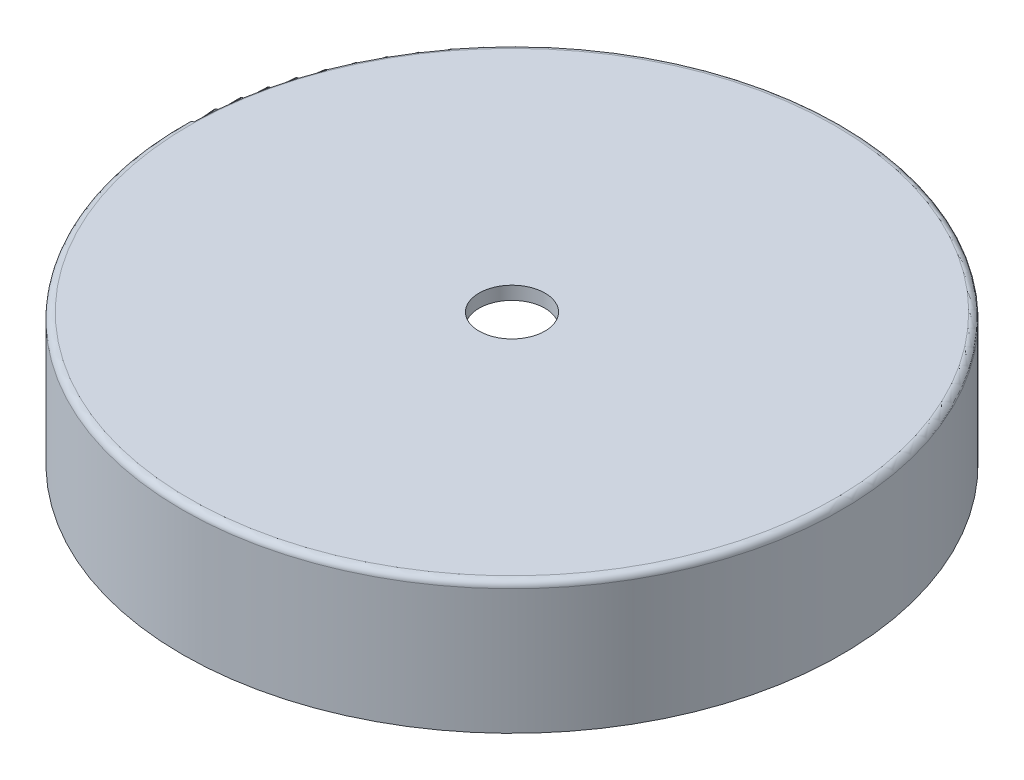
ISO-10303-21;
HEADER;
FILE_DESCRIPTION(('STEP AP214'),'2;1');
FILE_NAME('part.step','',(''),(''),'','','');
FILE_SCHEMA(('AUTOMOTIVE_DESIGN { 1 0 10303 214 1 1 1 1 }'));
ENDSEC;
DATA;
#1=APPLICATION_CONTEXT('core data for automotive mechanical design processes');
#2=APPLICATION_PROTOCOL_DEFINITION('international standard','automotive_design',2000,#1);
#3=PRODUCT_CONTEXT('',#1,'mechanical');
#4=PRODUCT('Part','Part','',(#3));
#5=PRODUCT_RELATED_PRODUCT_CATEGORY('part','',(#4));
#6=PRODUCT_DEFINITION_FORMATION('','',#4);
#7=PRODUCT_DEFINITION_CONTEXT('part definition',#1,'design');
#8=PRODUCT_DEFINITION('design','',#6,#7);
#9=PRODUCT_DEFINITION_SHAPE('','',#8);
#10=(LENGTH_UNIT() NAMED_UNIT(*) SI_UNIT(.MILLI.,.METRE.));
#11=(NAMED_UNIT(*) PLANE_ANGLE_UNIT() SI_UNIT($,.RADIAN.));
#12=(NAMED_UNIT(*) SI_UNIT($,.STERADIAN.) SOLID_ANGLE_UNIT());
#13=UNCERTAINTY_MEASURE_WITH_UNIT(LENGTH_MEASURE(1.E-05),#10,'distance_accuracy_value','');
#14=(GEOMETRIC_REPRESENTATION_CONTEXT(3) GLOBAL_UNCERTAINTY_ASSIGNED_CONTEXT((#13)) GLOBAL_UNIT_ASSIGNED_CONTEXT((#10,
#11,#12)) REPRESENTATION_CONTEXT('',''));
#15=CARTESIAN_POINT('',(0.,0.,0.));
#16=DIRECTION('',(0.,0.,1.));
#17=DIRECTION('',(1.,0.,0.));
#18=AXIS2_PLACEMENT_3D('',#15,#16,#17);
#19=CARTESIAN_POINT('',(0.,10.,0.));
#20=DIRECTION('',(0.,-1.,0.));
#21=DIRECTION('',(0.,0.,-1.));
#22=AXIS2_PLACEMENT_3D('',#19,#20,#21);
#23=PLANE('',#22);
#24=CARTESIAN_POINT('',(0.,10.,0.));
#25=DIRECTION('',(0.,1.,0.));
#26=DIRECTION('',(0.,0.,1.));
#27=AXIS2_PLACEMENT_3D('',#24,#25,#26);
#28=CIRCLE('',#27,2.5);
#29=CARTESIAN_POINT('',(0.,10.,2.5));
#30=VERTEX_POINT('',#29);
#31=EDGE_CURVE('E56',#30,#30,#28,.T.);
#32=ORIENTED_EDGE('',*,*,#31,.F.);
#33=EDGE_LOOP('',(#32));
#34=FACE_BOUND('',#33,.T.);
#35=CARTESIAN_POINT('',(0.,10.,0.));
#36=DIRECTION('',(0.,-1.,0.));
#37=DIRECTION('',(0.,0.,-1.));
#38=AXIS2_PLACEMENT_3D('',#35,#36,#37);
#39=CIRCLE('',#38,24.5);
#40=CARTESIAN_POINT('',(0.,10.,-24.5));
#41=VERTEX_POINT('',#40);
#42=EDGE_CURVE('E10',#41,#41,#39,.F.);
#43=ORIENTED_EDGE('',*,*,#42,.T.);
#44=EDGE_LOOP('',(#43));
#45=FACE_BOUND('',#44,.T.);
#46=ADVANCED_FACE('F30',(#34,#45),#23,.F.);
#47=CARTESIAN_POINT('',(0.,0.,0.));
#48=DIRECTION('',(0.,-1.,0.));
#49=DIRECTION('',(0.,0.,-1.));
#50=AXIS2_PLACEMENT_3D('',#47,#48,#49);
#51=CYLINDRICAL_SURFACE('',#50,25.);
#52=CARTESIAN_POINT('',(0.,9.5,0.));
#53=DIRECTION('',(0.,-1.,0.));
#54=DIRECTION('',(0.,0.,-1.));
#55=AXIS2_PLACEMENT_3D('',#52,#53,#54);
#56=CIRCLE('',#55,25.);
#57=CARTESIAN_POINT('',(0.,9.5,-25.));
#58=VERTEX_POINT('',#57);
#59=EDGE_CURVE('E38',#58,#58,#56,.T.);
#60=ORIENTED_EDGE('',*,*,#59,.T.);
#61=EDGE_LOOP('',(#60));
#62=FACE_BOUND('',#61,.T.);
#63=CARTESIAN_POINT('',(0.,0.,0.));
#64=DIRECTION('',(0.,-1.,0.));
#65=DIRECTION('',(0.,0.,-1.));
#66=AXIS2_PLACEMENT_3D('',#63,#64,#65);
#67=CIRCLE('',#66,25.);
#68=CARTESIAN_POINT('',(0.,0.,-25.));
#69=VERTEX_POINT('',#68);
#70=EDGE_CURVE('E50',#69,#69,#67,.T.);
#71=ORIENTED_EDGE('',*,*,#70,.F.);
#72=EDGE_LOOP('',(#71));
#73=FACE_BOUND('',#72,.T.);
#74=ADVANCED_FACE('F76',(#62,#73),#51,.T.);
#75=CARTESIAN_POINT('',(0.,0.,25.));
#76=DIRECTION('',(0.,1.,0.));
#77=DIRECTION('',(0.,0.,1.));
#78=AXIS2_PLACEMENT_3D('',#75,#76,#77);
#79=PLANE('',#78);
#80=CARTESIAN_POINT('',(0.,0.,0.));
#81=DIRECTION('',(0.,-1.,0.));
#82=DIRECTION('',(0.,0.,-1.));
#83=AXIS2_PLACEMENT_3D('',#80,#81,#82);
#84=CIRCLE('',#83,22.);
#85=CARTESIAN_POINT('',(0.,0.,-22.));
#86=VERTEX_POINT('',#85);
#87=EDGE_CURVE('E53',#86,#86,#84,.T.);
#88=ORIENTED_EDGE('',*,*,#87,.F.);
#89=EDGE_LOOP('',(#88));
#90=FACE_BOUND('',#89,.T.);
#91=ORIENTED_EDGE('',*,*,#70,.T.);
#92=EDGE_LOOP('',(#91));
#93=FACE_BOUND('',#92,.T.);
#94=ADVANCED_FACE('F82',(#90,#93),#79,.F.);
#95=CARTESIAN_POINT('',(0.,0.,0.));
#96=DIRECTION('',(0.,-1.,0.));
#97=DIRECTION('',(0.,0.,-1.));
#98=AXIS2_PLACEMENT_3D('',#95,#96,#97);
#99=CYLINDRICAL_SURFACE('',#98,22.);
#100=CARTESIAN_POINT('',(0.,8.5,0.));
#101=DIRECTION('',(0.,1.,0.));
#102=DIRECTION('',(0.,0.,1.));
#103=AXIS2_PLACEMENT_3D('',#100,#101,#102);
#104=CIRCLE('',#103,22.);
#105=CARTESIAN_POINT('',(0.,8.5,22.));
#106=VERTEX_POINT('',#105);
#107=EDGE_CURVE('E42',#106,#106,#104,.T.);
#108=ORIENTED_EDGE('',*,*,#107,.T.);
#109=EDGE_LOOP('',(#108));
#110=FACE_BOUND('',#109,.T.);
#111=ORIENTED_EDGE('',*,*,#87,.T.);
#112=EDGE_LOOP('',(#111));
#113=FACE_BOUND('',#112,.T.);
#114=ADVANCED_FACE('F91',(#110,#113),#99,.F.);
#115=CARTESIAN_POINT('',(0.,9.,22.));
#116=DIRECTION('',(0.,1.,0.));
#117=DIRECTION('',(0.,0.,1.));
#118=AXIS2_PLACEMENT_3D('',#115,#116,#117);
#119=PLANE('',#118);
#120=CARTESIAN_POINT('',(0.,9.,0.));
#121=DIRECTION('',(0.,1.,0.));
#122=DIRECTION('',(0.,0.,1.));
#123=AXIS2_PLACEMENT_3D('',#120,#121,#122);
#124=CIRCLE('',#123,2.5);
#125=CARTESIAN_POINT('',(0.,9.,2.5));
#126=VERTEX_POINT('',#125);
#127=EDGE_CURVE('E34',#126,#126,#124,.T.);
#128=ORIENTED_EDGE('',*,*,#127,.T.);
#129=EDGE_LOOP('',(#128));
#130=FACE_BOUND('',#129,.T.);
#131=CARTESIAN_POINT('',(0.,9.,0.));
#132=DIRECTION('',(0.,1.,0.));
#133=DIRECTION('',(0.,0.,1.));
#134=AXIS2_PLACEMENT_3D('',#131,#132,#133);
#135=CIRCLE('',#134,21.5);
#136=CARTESIAN_POINT('',(0.,9.,21.5));
#137=VERTEX_POINT('',#136);
#138=EDGE_CURVE('E47',#137,#137,#135,.F.);
#139=ORIENTED_EDGE('',*,*,#138,.T.);
#140=EDGE_LOOP('',(#139));
#141=FACE_BOUND('',#140,.T.);
#142=ADVANCED_FACE('F63',(#130,#141),#119,.F.);
#143=CARTESIAN_POINT('',(0.,8.5,0.));
#144=DIRECTION('',(0.,1.,0.));
#145=DIRECTION('',(0.,0.,1.));
#146=AXIS2_PLACEMENT_3D('',#143,#144,#145);
#147=TOROIDAL_SURFACE('',#146,21.5,0.5);
#148=ORIENTED_EDGE('',*,*,#107,.F.);
#149=EDGE_LOOP('',(#148));
#150=FACE_BOUND('',#149,.T.);
#151=ORIENTED_EDGE('',*,*,#138,.F.);
#152=EDGE_LOOP('',(#151));
#153=FACE_BOUND('',#152,.T.);
#154=ADVANCED_FACE('F72',(#150,#153),#147,.F.);
#155=CARTESIAN_POINT('',(0.,9.5,0.));
#156=DIRECTION('',(0.,-1.,0.));
#157=DIRECTION('',(0.,0.,-1.));
#158=AXIS2_PLACEMENT_3D('',#155,#156,#157);
#159=TOROIDAL_SURFACE('',#158,24.5,0.5);
#160=ORIENTED_EDGE('',*,*,#42,.F.);
#161=EDGE_LOOP('',(#160));
#162=FACE_BOUND('',#161,.T.);
#163=ORIENTED_EDGE('',*,*,#59,.F.);
#164=EDGE_LOOP('',(#163));
#165=FACE_BOUND('',#164,.T.);
#166=ADVANCED_FACE('F32',(#162,#165),#159,.T.);
#167=CARTESIAN_POINT('',(0.,0.,0.));
#168=DIRECTION('',(0.,1.,0.));
#169=DIRECTION('',(0.,0.,1.));
#170=AXIS2_PLACEMENT_3D('',#167,#168,#169);
#171=CYLINDRICAL_SURFACE('',#170,2.5);
#172=ORIENTED_EDGE('',*,*,#31,.T.);
#173=EDGE_LOOP('',(#172));
#174=FACE_BOUND('',#173,.T.);
#175=ORIENTED_EDGE('',*,*,#127,.F.);
#176=EDGE_LOOP('',(#175));
#177=FACE_BOUND('',#176,.T.);
#178=ADVANCED_FACE('F66',(#174,#177),#171,.F.);
#179=CLOSED_SHELL('',(#46,#74,#94,#114,#142,#154,#166,#178));
#180=MANIFOLD_SOLID_BREP('B2',#179);
#181=ADVANCED_BREP_SHAPE_REPRESENTATION('',(#18,#180),#14);
#182=SHAPE_DEFINITION_REPRESENTATION(#9,#181);
ENDSEC;
END-ISO-10303-21;
